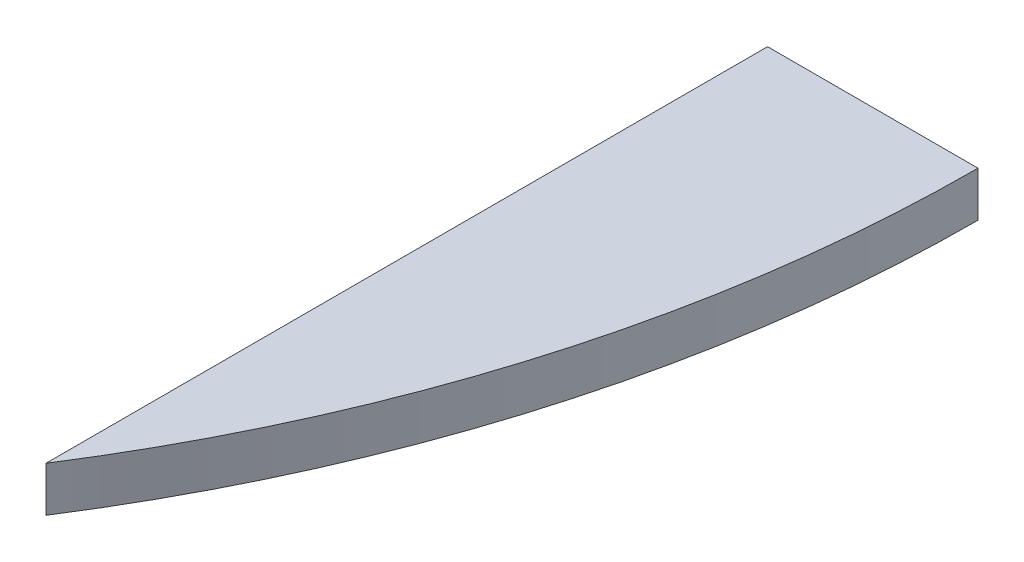
ISO-10303-21;
HEADER;
FILE_DESCRIPTION(('STEP AP214'),'2;1');
FILE_NAME('part.step','',(''),(''),'','','');
FILE_SCHEMA(('AUTOMOTIVE_DESIGN { 1 0 10303 214 1 1 1 1 }'));
ENDSEC;
DATA;
#1=APPLICATION_CONTEXT('core data for automotive mechanical design processes');
#2=APPLICATION_PROTOCOL_DEFINITION('international standard','automotive_design',2000,#1);
#3=PRODUCT_CONTEXT('',#1,'mechanical');
#4=PRODUCT('Part','Part','',(#3));
#5=PRODUCT_RELATED_PRODUCT_CATEGORY('part','',(#4));
#6=PRODUCT_DEFINITION_FORMATION('','',#4);
#7=PRODUCT_DEFINITION_CONTEXT('part definition',#1,'design');
#8=PRODUCT_DEFINITION('design','',#6,#7);
#9=PRODUCT_DEFINITION_SHAPE('','',#8);
#10=(LENGTH_UNIT() NAMED_UNIT(*) SI_UNIT(.MILLI.,.METRE.));
#11=(NAMED_UNIT(*) PLANE_ANGLE_UNIT() SI_UNIT($,.RADIAN.));
#12=(NAMED_UNIT(*) SI_UNIT($,.STERADIAN.) SOLID_ANGLE_UNIT());
#13=UNCERTAINTY_MEASURE_WITH_UNIT(LENGTH_MEASURE(1.E-05),#10,'distance_accuracy_value','');
#14=(GEOMETRIC_REPRESENTATION_CONTEXT(3) GLOBAL_UNCERTAINTY_ASSIGNED_CONTEXT((#13)) GLOBAL_UNIT_ASSIGNED_CONTEXT((#10,
#11,#12)) REPRESENTATION_CONTEXT('',''));
#15=CARTESIAN_POINT('',(0.,0.,0.));
#16=DIRECTION('',(0.,0.,1.));
#17=DIRECTION('',(1.,0.,0.));
#18=AXIS2_PLACEMENT_3D('',#15,#16,#17);
#19=CARTESIAN_POINT('',(-75.2857142857143,3.,-48.));
#20=DIRECTION('',(0.,-1.,0.));
#21=DIRECTION('',(0.,0.,-1.));
#22=AXIS2_PLACEMENT_3D('',#19,#20,#21);
#23=CYLINDRICAL_SURFACE('',#22,89.2857142857143);
#24=CARTESIAN_POINT('',(-75.2857142857143,0.,-48.));
#25=DIRECTION('',(0.,1.,0.));
#26=DIRECTION('',(0.,0.,-1.));
#27=AXIS2_PLACEMENT_3D('',#24,#25,#26);
#28=CIRCLE('',#27,89.2857142857143);
#29=CARTESIAN_POINT('',(0.,0.,0.));
#30=VERTEX_POINT('',#29);
#31=CARTESIAN_POINT('',(14.,0.,-48.));
#32=VERTEX_POINT('',#31);
#33=EDGE_CURVE('E80',#30,#32,#28,.T.);
#34=ORIENTED_EDGE('',*,*,#33,.T.);
#35=DIRECTION('',(0.,-1.,0.));
#36=VECTOR('',#35,1.);
#37=CARTESIAN_POINT('',(14.,3.,-48.));
#38=LINE('',#37,#36);
#39=CARTESIAN_POINT('',(14.,3.,-48.));
#40=VERTEX_POINT('',#39);
#41=EDGE_CURVE('E11',#40,#32,#38,.T.);
#42=ORIENTED_EDGE('',*,*,#41,.F.);
#43=CARTESIAN_POINT('',(-75.2857142857143,3.,-48.));
#44=DIRECTION('',(0.,1.,0.));
#45=DIRECTION('',(0.,0.,-1.));
#46=AXIS2_PLACEMENT_3D('',#43,#44,#45);
#47=CIRCLE('',#46,89.2857142857143);
#48=CARTESIAN_POINT('',(0.,3.,0.));
#49=VERTEX_POINT('',#48);
#50=EDGE_CURVE('E73',#49,#40,#47,.T.);
#51=ORIENTED_EDGE('',*,*,#50,.F.);
#52=DIRECTION('',(0.,-1.,0.));
#53=VECTOR('',#52,1.);
#54=CARTESIAN_POINT('',(0.,3.,0.));
#55=LINE('',#54,#53);
#56=EDGE_CURVE('E81',#49,#30,#55,.T.);
#57=ORIENTED_EDGE('',*,*,#56,.T.);
#58=EDGE_LOOP('',(#34,#42,#51,#57));
#59=FACE_BOUND('',#58,.T.);
#60=ADVANCED_FACE('F33',(#59),#23,.T.);
#61=CARTESIAN_POINT('',(0.,3.,-48.));
#62=DIRECTION('',(0.,0.,1.));
#63=DIRECTION('',(1.,0.,0.));
#64=AXIS2_PLACEMENT_3D('',#61,#62,#63);
#65=PLANE('',#64);
#66=DIRECTION('',(-1.,0.,0.));
#67=VECTOR('',#66,1.);
#68=CARTESIAN_POINT('',(0.,0.,-48.));
#69=LINE('',#68,#67);
#70=CARTESIAN_POINT('',(0.,0.,-48.));
#71=VERTEX_POINT('',#70);
#72=EDGE_CURVE('E61',#32,#71,#69,.T.);
#73=ORIENTED_EDGE('',*,*,#72,.T.);
#74=DIRECTION('',(0.,-1.,0.));
#75=VECTOR('',#74,1.);
#76=CARTESIAN_POINT('',(0.,3.,-48.));
#77=LINE('',#76,#75);
#78=CARTESIAN_POINT('',(0.,3.,-48.));
#79=VERTEX_POINT('',#78);
#80=EDGE_CURVE('E41',#79,#71,#77,.T.);
#81=ORIENTED_EDGE('',*,*,#80,.F.);
#82=DIRECTION('',(-1.,0.,0.));
#83=VECTOR('',#82,1.);
#84=CARTESIAN_POINT('',(0.,3.,-48.));
#85=LINE('',#84,#83);
#86=EDGE_CURVE('E69',#40,#79,#85,.T.);
#87=ORIENTED_EDGE('',*,*,#86,.F.);
#88=ORIENTED_EDGE('',*,*,#41,.T.);
#89=EDGE_LOOP('',(#73,#81,#87,#88));
#90=FACE_BOUND('',#89,.T.);
#91=ADVANCED_FACE('F70',(#90),#65,.F.);
#92=CARTESIAN_POINT('',(0.,3.,0.));
#93=DIRECTION('',(1.,0.,0.));
#94=DIRECTION('',(0.,0.,-1.));
#95=AXIS2_PLACEMENT_3D('',#92,#93,#94);
#96=PLANE('',#95);
#97=DIRECTION('',(0.,0.,1.));
#98=VECTOR('',#97,1.);
#99=CARTESIAN_POINT('',(0.,0.,0.));
#100=LINE('',#99,#98);
#101=EDGE_CURVE('E66',#71,#30,#100,.T.);
#102=ORIENTED_EDGE('',*,*,#101,.T.);
#103=ORIENTED_EDGE('',*,*,#56,.F.);
#104=DIRECTION('',(0.,0.,1.));
#105=VECTOR('',#104,1.);
#106=CARTESIAN_POINT('',(0.,3.,0.));
#107=LINE('',#106,#105);
#108=EDGE_CURVE('E49',#79,#49,#107,.T.);
#109=ORIENTED_EDGE('',*,*,#108,.F.);
#110=ORIENTED_EDGE('',*,*,#80,.T.);
#111=EDGE_LOOP('',(#102,#103,#109,#110));
#112=FACE_BOUND('',#111,.T.);
#113=ADVANCED_FACE('F88',(#112),#96,.F.);
#114=CARTESIAN_POINT('',(-75.2857142857143,3.,-48.));
#115=DIRECTION('',(0.,-1.,0.));
#116=DIRECTION('',(0.,0.,-1.));
#117=AXIS2_PLACEMENT_3D('',#114,#115,#116);
#118=PLANE('',#117);
#119=ORIENTED_EDGE('',*,*,#50,.T.);
#120=ORIENTED_EDGE('',*,*,#86,.T.);
#121=ORIENTED_EDGE('',*,*,#108,.T.);
#122=EDGE_LOOP('',(#119,#120,#121));
#123=FACE_BOUND('',#122,.T.);
#124=ADVANCED_FACE('F76',(#123),#118,.F.);
#125=CARTESIAN_POINT('',(-75.2857142857143,0.,-48.));
#126=DIRECTION('',(0.,-1.,0.));
#127=DIRECTION('',(0.,0.,-1.));
#128=AXIS2_PLACEMENT_3D('',#125,#126,#127);
#129=PLANE('',#128);
#130=ORIENTED_EDGE('',*,*,#33,.F.);
#131=ORIENTED_EDGE('',*,*,#101,.F.);
#132=ORIENTED_EDGE('',*,*,#72,.F.);
#133=EDGE_LOOP('',(#130,#131,#132));
#134=FACE_BOUND('',#133,.T.);
#135=ADVANCED_FACE('F89',(#134),#129,.T.);
#136=CLOSED_SHELL('',(#60,#91,#113,#124,#135));
#137=MANIFOLD_SOLID_BREP('B2',#136);
#138=ADVANCED_BREP_SHAPE_REPRESENTATION('',(#18,#137),#14);
#139=SHAPE_DEFINITION_REPRESENTATION(#9,#138);
ENDSEC;
END-ISO-10303-21;
